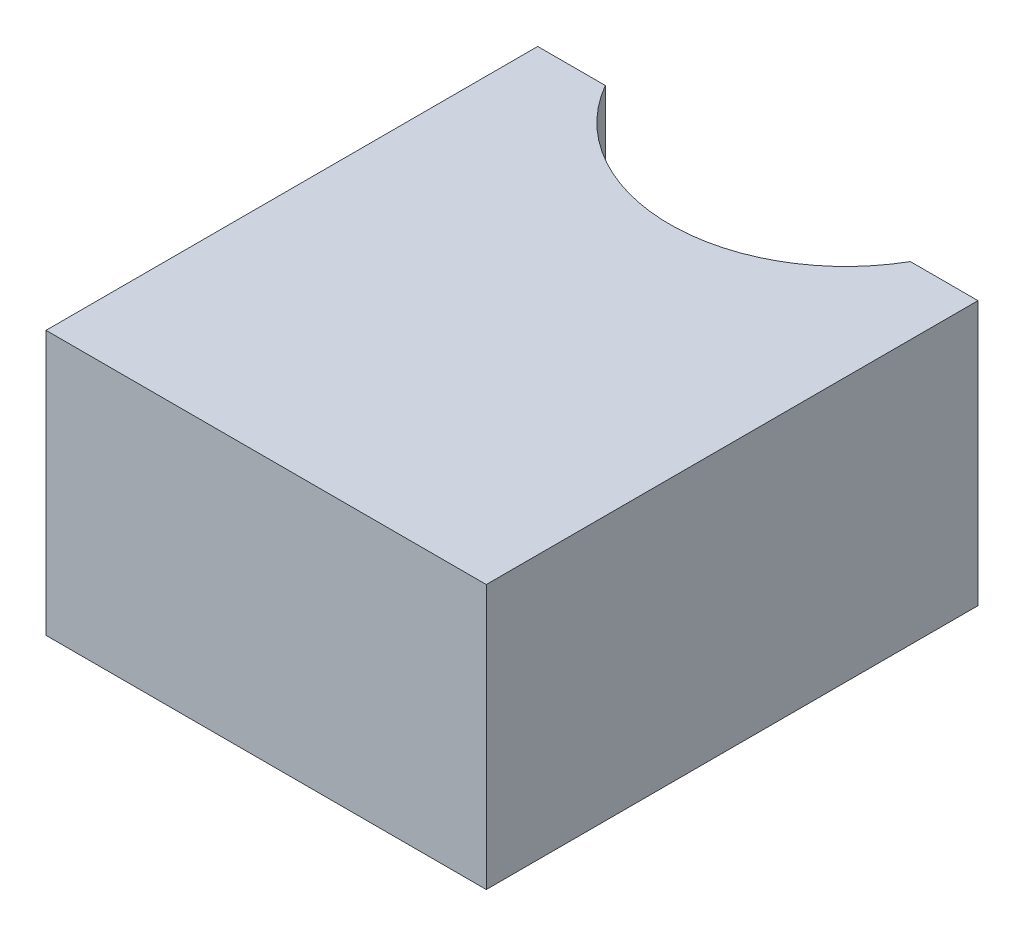
ISO-10303-21;
HEADER;
FILE_DESCRIPTION(('STEP AP214'),'2;1');
FILE_NAME('part.step','',(''),(''),'','','');
FILE_SCHEMA(('AUTOMOTIVE_DESIGN { 1 0 10303 214 1 1 1 1 }'));
ENDSEC;
DATA;
#1=APPLICATION_CONTEXT('core data for automotive mechanical design processes');
#2=APPLICATION_PROTOCOL_DEFINITION('international standard','automotive_design',2000,#1);
#3=PRODUCT_CONTEXT('',#1,'mechanical');
#4=PRODUCT('Part','Part','',(#3));
#5=PRODUCT_RELATED_PRODUCT_CATEGORY('part','',(#4));
#6=PRODUCT_DEFINITION_FORMATION('','',#4);
#7=PRODUCT_DEFINITION_CONTEXT('part definition',#1,'design');
#8=PRODUCT_DEFINITION('design','',#6,#7);
#9=PRODUCT_DEFINITION_SHAPE('','',#8);
#10=(LENGTH_UNIT() NAMED_UNIT(*) SI_UNIT(.MILLI.,.METRE.));
#11=(NAMED_UNIT(*) PLANE_ANGLE_UNIT() SI_UNIT($,.RADIAN.));
#12=(NAMED_UNIT(*) SI_UNIT($,.STERADIAN.) SOLID_ANGLE_UNIT());
#13=UNCERTAINTY_MEASURE_WITH_UNIT(LENGTH_MEASURE(1.E-05),#10,'distance_accuracy_value','');
#14=(GEOMETRIC_REPRESENTATION_CONTEXT(3) GLOBAL_UNCERTAINTY_ASSIGNED_CONTEXT((#13)) GLOBAL_UNIT_ASSIGNED_CONTEXT((#10,
#11,#12)) REPRESENTATION_CONTEXT('',''));
#15=CARTESIAN_POINT('',(0.,0.,0.));
#16=DIRECTION('',(0.,0.,1.));
#17=DIRECTION('',(1.,0.,0.));
#18=AXIS2_PLACEMENT_3D('',#15,#16,#17);
#19=CARTESIAN_POINT('',(0.,0.,0.));
#20=DIRECTION('',(0.,0.,1.));
#21=DIRECTION('',(1.,0.,0.));
#22=AXIS2_PLACEMENT_3D('',#19,#20,#21);
#23=PLANE('',#22);
#24=DIRECTION('',(1.,0.,0.));
#25=VECTOR('',#24,1.);
#26=CARTESIAN_POINT('',(-15.875,-9.525,0.));
#27=LINE('',#26,#25);
#28=CARTESIAN_POINT('',(10.9985226280624,-9.525,0.));
#29=VERTEX_POINT('',#28);
#30=CARTESIAN_POINT('',(15.875,-9.525,0.));
#31=VERTEX_POINT('',#30);
#32=EDGE_CURVE('E88',#29,#31,#27,.T.);
#33=ORIENTED_EDGE('',*,*,#32,.F.);
#34=DIRECTION('',(0.,1.,0.));
#35=VECTOR('',#34,1.);
#36=CARTESIAN_POINT('',(10.9985226280624,-9.525,0.));
#37=LINE('',#36,#35);
#38=CARTESIAN_POINT('',(10.9985226280624,9.525,0.));
#39=VERTEX_POINT('',#38);
#40=EDGE_CURVE('E11',#29,#39,#37,.T.);
#41=ORIENTED_EDGE('',*,*,#40,.T.);
#42=DIRECTION('',(-1.,0.,0.));
#43=VECTOR('',#42,1.);
#44=CARTESIAN_POINT('',(-15.875,9.525,0.));
#45=LINE('',#44,#43);
#46=CARTESIAN_POINT('',(15.875,9.525,0.));
#47=VERTEX_POINT('',#46);
#48=EDGE_CURVE('E112',#47,#39,#45,.T.);
#49=ORIENTED_EDGE('',*,*,#48,.F.);
#50=DIRECTION('',(0.,1.,0.));
#51=VECTOR('',#50,1.);
#52=CARTESIAN_POINT('',(15.875,9.525,0.));
#53=LINE('',#52,#51);
#54=EDGE_CURVE('E124',#31,#47,#53,.T.);
#55=ORIENTED_EDGE('',*,*,#54,.F.);
#56=EDGE_LOOP('',(#33,#41,#49,#55));
#57=FACE_BOUND('',#56,.T.);
#58=ADVANCED_FACE('F43',(#57),#23,.F.);
#59=CARTESIAN_POINT('',(15.875,9.525,35.4584));
#60=DIRECTION('',(-1.,0.,0.));
#61=DIRECTION('',(0.,0.,1.));
#62=AXIS2_PLACEMENT_3D('',#59,#60,#61);
#63=PLANE('',#62);
#64=ORIENTED_EDGE('',*,*,#54,.T.);
#65=DIRECTION('',(0.,0.,-1.));
#66=VECTOR('',#65,1.);
#67=CARTESIAN_POINT('',(15.875,9.525,35.4584));
#68=LINE('',#67,#66);
#69=CARTESIAN_POINT('',(15.875,9.525,35.4584));
#70=VERTEX_POINT('',#69);
#71=EDGE_CURVE('E115',#70,#47,#68,.T.);
#72=ORIENTED_EDGE('',*,*,#71,.F.);
#73=DIRECTION('',(0.,1.,0.));
#74=VECTOR('',#73,1.);
#75=CARTESIAN_POINT('',(15.875,9.525,35.4584));
#76=LINE('',#75,#74);
#77=CARTESIAN_POINT('',(15.875,-9.525,35.4584));
#78=VERTEX_POINT('',#77);
#79=EDGE_CURVE('E132',#78,#70,#76,.T.);
#80=ORIENTED_EDGE('',*,*,#79,.F.);
#81=DIRECTION('',(0.,0.,-1.));
#82=VECTOR('',#81,1.);
#83=CARTESIAN_POINT('',(15.875,-9.525,35.4584));
#84=LINE('',#83,#82);
#85=EDGE_CURVE('E133',#78,#31,#84,.T.);
#86=ORIENTED_EDGE('',*,*,#85,.T.);
#87=EDGE_LOOP('',(#64,#72,#80,#86));
#88=FACE_BOUND('',#87,.T.);
#89=ADVANCED_FACE('F45',(#88),#63,.F.);
#90=CARTESIAN_POINT('',(-15.875,9.525,35.4584));
#91=DIRECTION('',(0.,-1.,0.));
#92=DIRECTION('',(0.,0.,-1.));
#93=AXIS2_PLACEMENT_3D('',#90,#91,#92);
#94=PLANE('',#93);
#95=ORIENTED_EDGE('',*,*,#48,.T.);
#96=CARTESIAN_POINT('',(0.,9.525,-6.35));
#97=DIRECTION('',(0.,1.,0.));
#98=DIRECTION('',(0.,0.,1.));
#99=AXIS2_PLACEMENT_3D('',#96,#97,#98);
#100=CIRCLE('',#99,12.7);
#101=CARTESIAN_POINT('',(-10.9985226280624,9.525,0.));
#102=VERTEX_POINT('',#101);
#103=EDGE_CURVE('E104',#102,#39,#100,.T.);
#104=ORIENTED_EDGE('',*,*,#103,.F.);
#105=CARTESIAN_POINT('',(-15.875,9.525,0.));
#106=VERTEX_POINT('',#105);
#107=EDGE_CURVE('E119',#102,#106,#45,.T.);
#108=ORIENTED_EDGE('',*,*,#107,.T.);
#109=DIRECTION('',(0.,0.,-1.));
#110=VECTOR('',#109,1.);
#111=CARTESIAN_POINT('',(-15.875,9.525,35.4584));
#112=LINE('',#111,#110);
#113=CARTESIAN_POINT('',(-15.875,9.525,35.4584));
#114=VERTEX_POINT('',#113);
#115=EDGE_CURVE('E140',#114,#106,#112,.T.);
#116=ORIENTED_EDGE('',*,*,#115,.F.);
#117=DIRECTION('',(-1.,0.,0.));
#118=VECTOR('',#117,1.);
#119=CARTESIAN_POINT('',(-15.875,9.525,35.4584));
#120=LINE('',#119,#118);
#121=EDGE_CURVE('E96',#70,#114,#120,.T.);
#122=ORIENTED_EDGE('',*,*,#121,.F.);
#123=ORIENTED_EDGE('',*,*,#71,.T.);
#124=EDGE_LOOP('',(#95,#104,#108,#116,#122,#123));
#125=FACE_BOUND('',#124,.T.);
#126=ADVANCED_FACE('F113',(#125),#94,.F.);
#127=CARTESIAN_POINT('',(-15.875,9.525,35.4584));
#128=DIRECTION('',(1.,0.,0.));
#129=DIRECTION('',(0.,0.,-1.));
#130=AXIS2_PLACEMENT_3D('',#127,#128,#129);
#131=PLANE('',#130);
#132=DIRECTION('',(0.,-1.,0.));
#133=VECTOR('',#132,1.);
#134=CARTESIAN_POINT('',(-15.875,9.525,0.));
#135=LINE('',#134,#133);
#136=CARTESIAN_POINT('',(-15.875,-9.525,0.));
#137=VERTEX_POINT('',#136);
#138=EDGE_CURVE('E118',#106,#137,#135,.T.);
#139=ORIENTED_EDGE('',*,*,#138,.T.);
#140=DIRECTION('',(0.,0.,-1.));
#141=VECTOR('',#140,1.);
#142=CARTESIAN_POINT('',(-15.875,-9.525,35.4584));
#143=LINE('',#142,#141);
#144=CARTESIAN_POINT('',(-15.875,-9.525,35.4584));
#145=VERTEX_POINT('',#144);
#146=EDGE_CURVE('E136',#145,#137,#143,.T.);
#147=ORIENTED_EDGE('',*,*,#146,.F.);
#148=DIRECTION('',(0.,-1.,0.));
#149=VECTOR('',#148,1.);
#150=CARTESIAN_POINT('',(-15.875,9.525,35.4584));
#151=LINE('',#150,#149);
#152=EDGE_CURVE('E155',#114,#145,#151,.T.);
#153=ORIENTED_EDGE('',*,*,#152,.F.);
#154=ORIENTED_EDGE('',*,*,#115,.T.);
#155=EDGE_LOOP('',(#139,#147,#153,#154));
#156=FACE_BOUND('',#155,.T.);
#157=ADVANCED_FACE('F154',(#156),#131,.F.);
#158=CARTESIAN_POINT('',(-15.875,-9.525,35.4584));
#159=DIRECTION('',(0.,1.,0.));
#160=DIRECTION('',(0.,0.,1.));
#161=AXIS2_PLACEMENT_3D('',#158,#159,#160);
#162=PLANE('',#161);
#163=CARTESIAN_POINT('',(-10.9985226280624,-9.525,0.));
#164=VERTEX_POINT('',#163);
#165=EDGE_CURVE('E128',#137,#164,#27,.T.);
#166=ORIENTED_EDGE('',*,*,#165,.T.);
#167=CARTESIAN_POINT('',(0.,-9.525,-6.35));
#168=DIRECTION('',(0.,1.,0.));
#169=DIRECTION('',(0.,0.,1.));
#170=AXIS2_PLACEMENT_3D('',#167,#168,#169);
#171=CIRCLE('',#170,12.7);
#172=EDGE_CURVE('E59',#164,#29,#171,.T.);
#173=ORIENTED_EDGE('',*,*,#172,.T.);
#174=ORIENTED_EDGE('',*,*,#32,.T.);
#175=ORIENTED_EDGE('',*,*,#85,.F.);
#176=DIRECTION('',(1.,0.,0.));
#177=VECTOR('',#176,1.);
#178=CARTESIAN_POINT('',(-15.875,-9.525,35.4584));
#179=LINE('',#178,#177);
#180=EDGE_CURVE('E68',#145,#78,#179,.T.);
#181=ORIENTED_EDGE('',*,*,#180,.F.);
#182=ORIENTED_EDGE('',*,*,#146,.T.);
#183=EDGE_LOOP('',(#166,#173,#174,#175,#181,#182));
#184=FACE_BOUND('',#183,.T.);
#185=ADVANCED_FACE('F150',(#184),#162,.F.);
#186=CARTESIAN_POINT('',(0.,0.,35.4584));
#187=DIRECTION('',(0.,0.,1.));
#188=DIRECTION('',(1.,0.,0.));
#189=AXIS2_PLACEMENT_3D('',#186,#187,#188);
#190=PLANE('',#189);
#191=ORIENTED_EDGE('',*,*,#79,.T.);
#192=ORIENTED_EDGE('',*,*,#121,.T.);
#193=ORIENTED_EDGE('',*,*,#152,.T.);
#194=ORIENTED_EDGE('',*,*,#180,.T.);
#195=EDGE_LOOP('',(#191,#192,#193,#194));
#196=FACE_BOUND('',#195,.T.);
#197=ADVANCED_FACE('F168',(#196),#190,.T.);
#198=ORIENTED_EDGE('',*,*,#107,.F.);
#199=DIRECTION('',(0.,1.,0.));
#200=VECTOR('',#199,1.);
#201=CARTESIAN_POINT('',(-10.9985226280624,-9.525,0.));
#202=LINE('',#201,#200);
#203=EDGE_CURVE('E52',#102,#164,#202,.F.);
#204=ORIENTED_EDGE('',*,*,#203,.T.);
#205=ORIENTED_EDGE('',*,*,#165,.F.);
#206=ORIENTED_EDGE('',*,*,#138,.F.);
#207=EDGE_LOOP('',(#198,#204,#205,#206));
#208=FACE_BOUND('',#207,.T.);
#209=ADVANCED_FACE('F148',(#208),#23,.F.);
#210=CARTESIAN_POINT('',(0.,-9.525,-6.35));
#211=DIRECTION('',(0.,1.,0.));
#212=DIRECTION('',(0.,0.,1.));
#213=AXIS2_PLACEMENT_3D('',#210,#211,#212);
#214=CYLINDRICAL_SURFACE('',#213,12.7);
#215=ORIENTED_EDGE('',*,*,#172,.F.);
#216=ORIENTED_EDGE('',*,*,#203,.F.);
#217=ORIENTED_EDGE('',*,*,#103,.T.);
#218=ORIENTED_EDGE('',*,*,#40,.F.);
#219=EDGE_LOOP('',(#215,#216,#217,#218));
#220=FACE_BOUND('',#219,.T.);
#221=ADVANCED_FACE('F105',(#220),#214,.F.);
#222=CLOSED_SHELL('',(#58,#89,#126,#157,#185,#197,#209,#221));
#223=MANIFOLD_SOLID_BREP('B2',#222);
#224=ADVANCED_BREP_SHAPE_REPRESENTATION('',(#18,#223),#14);
#225=SHAPE_DEFINITION_REPRESENTATION(#9,#224);
ENDSEC;
END-ISO-10303-21;
